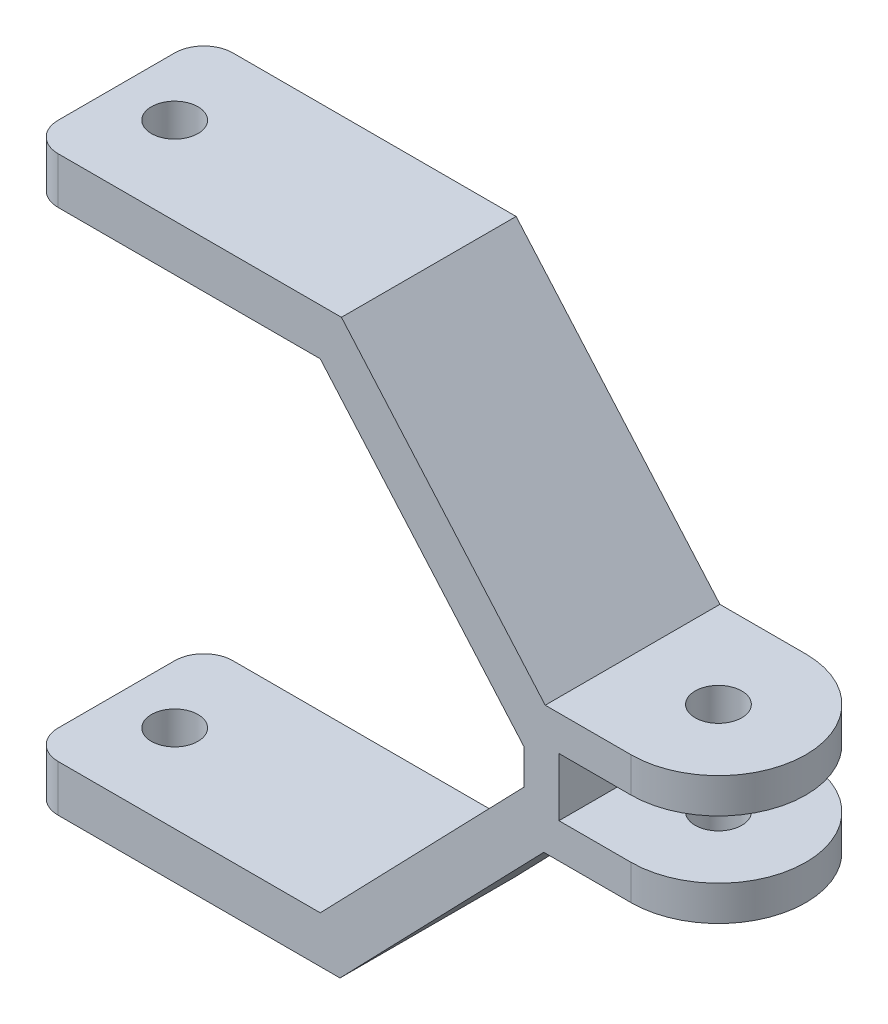
ISO-10303-21;
HEADER;
FILE_DESCRIPTION(('STEP AP214'),'2;1');
FILE_NAME('part.step','',(''),(''),'','','');
FILE_SCHEMA(('AUTOMOTIVE_DESIGN { 1 0 10303 214 1 1 1 1 }'));
ENDSEC;
DATA;
#1=APPLICATION_CONTEXT('core data for automotive mechanical design processes');
#2=APPLICATION_PROTOCOL_DEFINITION('international standard','automotive_design',2000,#1);
#3=PRODUCT_CONTEXT('',#1,'mechanical');
#4=PRODUCT('Part','Part','',(#3));
#5=PRODUCT_RELATED_PRODUCT_CATEGORY('part','',(#4));
#6=PRODUCT_DEFINITION_FORMATION('','',#4);
#7=PRODUCT_DEFINITION_CONTEXT('part definition',#1,'design');
#8=PRODUCT_DEFINITION('design','',#6,#7);
#9=PRODUCT_DEFINITION_SHAPE('','',#8);
#10=(LENGTH_UNIT() NAMED_UNIT(*) SI_UNIT(.MILLI.,.METRE.));
#11=(NAMED_UNIT(*) PLANE_ANGLE_UNIT() SI_UNIT($,.RADIAN.));
#12=(NAMED_UNIT(*) SI_UNIT($,.STERADIAN.) SOLID_ANGLE_UNIT());
#13=UNCERTAINTY_MEASURE_WITH_UNIT(LENGTH_MEASURE(1.E-05),#10,'distance_accuracy_value','');
#14=(GEOMETRIC_REPRESENTATION_CONTEXT(3) GLOBAL_UNCERTAINTY_ASSIGNED_CONTEXT((#13)) GLOBAL_UNIT_ASSIGNED_CONTEXT((#10,
#11,#12)) REPRESENTATION_CONTEXT('',''));
#15=CARTESIAN_POINT('',(0.,0.,0.));
#16=DIRECTION('',(0.,0.,1.));
#17=DIRECTION('',(1.,0.,0.));
#18=AXIS2_PLACEMENT_3D('',#15,#16,#17);
#19=CARTESIAN_POINT('',(-26.6964809757769,45.2,15.));
#20=DIRECTION('',(0.75420147757774,0.656643077493058,0.));
#21=DIRECTION('',(-0.656643077493058,0.75420147757774,0.));
#22=AXIS2_PLACEMENT_3D('',#19,#20,#21);
#23=PLANE('',#22);
#24=DIRECTION('',(0.656643077493058,-0.75420147757774,0.));
#25=VECTOR('',#24,1.);
#26=CARTESIAN_POINT('',(-26.6964809757769,45.2,0.));
#27=LINE('',#26,#25);
#28=CARTESIAN_POINT('',(-26.6964809757769,45.2,0.));
#29=VERTEX_POINT('',#28);
#30=CARTESIAN_POINT('',(-9.19648097577691,25.1,0.));
#31=VERTEX_POINT('',#30);
#32=EDGE_CURVE('E231',#29,#31,#27,.T.);
#33=ORIENTED_EDGE('',*,*,#32,.T.);
#34=DIRECTION('',(0.,0.,-1.));
#35=VECTOR('',#34,1.);
#36=CARTESIAN_POINT('',(-9.19648097577691,25.1,15.));
#37=LINE('',#36,#35);
#38=CARTESIAN_POINT('',(-9.19648097577691,25.1,15.));
#39=VERTEX_POINT('',#38);
#40=EDGE_CURVE('E332',#39,#31,#37,.T.);
#41=ORIENTED_EDGE('',*,*,#40,.F.);
#42=DIRECTION('',(0.656643077493058,-0.75420147757774,0.));
#43=VECTOR('',#42,1.);
#44=CARTESIAN_POINT('',(-26.6964809757769,45.2,15.));
#45=LINE('',#44,#43);
#46=CARTESIAN_POINT('',(-26.6964809757769,45.2,15.));
#47=VERTEX_POINT('',#46);
#48=EDGE_CURVE('E232',#47,#39,#45,.T.);
#49=ORIENTED_EDGE('',*,*,#48,.F.);
#50=DIRECTION('',(0.,0.,-1.));
#51=VECTOR('',#50,1.);
#52=CARTESIAN_POINT('',(-26.6964809757769,45.2,15.));
#53=LINE('',#52,#51);
#54=EDGE_CURVE('E267',#47,#29,#53,.T.);
#55=ORIENTED_EDGE('',*,*,#54,.T.);
#56=EDGE_LOOP('',(#33,#41,#49,#55));
#57=FACE_BOUND('',#56,.T.);
#58=ADVANCED_FACE('F33',(#57),#23,.F.);
#59=CARTESIAN_POINT('',(-9.19648097577691,25.1,15.));
#60=DIRECTION('',(1.,0.,0.));
#61=DIRECTION('',(0.,1.,0.));
#62=AXIS2_PLACEMENT_3D('',#59,#60,#61);
#63=PLANE('',#62);
#64=DIRECTION('',(0.,-1.,0.));
#65=VECTOR('',#64,1.);
#66=CARTESIAN_POINT('',(-9.19648097577691,25.1,0.));
#67=LINE('',#66,#65);
#68=CARTESIAN_POINT('',(-9.19648097577692,22.1,0.));
#69=VERTEX_POINT('',#68);
#70=EDGE_CURVE('E270',#31,#69,#67,.T.);
#71=ORIENTED_EDGE('',*,*,#70,.T.);
#72=DIRECTION('',(0.,0.,-1.));
#73=VECTOR('',#72,1.);
#74=CARTESIAN_POINT('',(-9.19648097577692,22.1,15.));
#75=LINE('',#74,#73);
#76=CARTESIAN_POINT('',(-9.19648097577692,22.1,15.));
#77=VERTEX_POINT('',#76);
#78=EDGE_CURVE('E329',#77,#69,#75,.T.);
#79=ORIENTED_EDGE('',*,*,#78,.F.);
#80=DIRECTION('',(0.,-1.,0.));
#81=VECTOR('',#80,1.);
#82=CARTESIAN_POINT('',(-9.19648097577691,25.1,15.));
#83=LINE('',#82,#81);
#84=EDGE_CURVE('E235',#39,#77,#83,.T.);
#85=ORIENTED_EDGE('',*,*,#84,.F.);
#86=ORIENTED_EDGE('',*,*,#40,.T.);
#87=EDGE_LOOP('',(#71,#79,#85,#86));
#88=FACE_BOUND('',#87,.T.);
#89=ADVANCED_FACE('F398',(#88),#63,.F.);
#90=CARTESIAN_POINT('',(-9.19648097577692,22.1,15.));
#91=DIRECTION('',(0.718922211716419,-0.695090536189907,0.));
#92=DIRECTION('',(0.695090536189907,0.718922211716419,0.));
#93=AXIS2_PLACEMENT_3D('',#90,#91,#92);
#94=PLANE('',#93);
#95=DIRECTION('',(-0.695090536189907,-0.718922211716419,0.));
#96=VECTOR('',#95,1.);
#97=CARTESIAN_POINT('',(-9.19648097577692,22.1,0.));
#98=LINE('',#97,#96);
#99=CARTESIAN_POINT('',(-26.6964809757769,4.,0.));
#100=VERTEX_POINT('',#99);
#101=EDGE_CURVE('E272',#69,#100,#98,.T.);
#102=ORIENTED_EDGE('',*,*,#101,.T.);
#103=DIRECTION('',(0.,0.,-1.));
#104=VECTOR('',#103,1.);
#105=CARTESIAN_POINT('',(-26.6964809757769,4.,15.));
#106=LINE('',#105,#104);
#107=CARTESIAN_POINT('',(-26.6964809757769,4.,15.));
#108=VERTEX_POINT('',#107);
#109=EDGE_CURVE('E326',#108,#100,#106,.T.);
#110=ORIENTED_EDGE('',*,*,#109,.F.);
#111=DIRECTION('',(-0.695090536189907,-0.718922211716419,0.));
#112=VECTOR('',#111,1.);
#113=CARTESIAN_POINT('',(-9.19648097577692,22.1,15.));
#114=LINE('',#113,#112);
#115=EDGE_CURVE('E238',#77,#108,#114,.T.);
#116=ORIENTED_EDGE('',*,*,#115,.F.);
#117=ORIENTED_EDGE('',*,*,#78,.T.);
#118=EDGE_LOOP('',(#102,#110,#116,#117));
#119=FACE_BOUND('',#118,.T.);
#120=ADVANCED_FACE('F386',(#119),#94,.F.);
#121=CARTESIAN_POINT('',(-51.6964809757769,3.99999999999999,15.));
#122=DIRECTION('',(0.,-1.,0.));
#123=DIRECTION('',(0.,0.,-1.));
#124=AXIS2_PLACEMENT_3D('',#121,#122,#123);
#125=PLANE('',#124);
#126=CARTESIAN_POINT('',(-46.6964809757769,3.99999999999999,7.5));
#127=DIRECTION('',(0.,-1.,0.));
#128=DIRECTION('',(0.,0.,-1.));
#129=AXIS2_PLACEMENT_3D('',#126,#127,#128);
#130=CIRCLE('',#129,2.);
#131=CARTESIAN_POINT('',(-44.6964809757769,4.,7.5));
#132=VERTEX_POINT('',#131);
#133=EDGE_CURVE('E228',#132,#132,#130,.T.);
#134=ORIENTED_EDGE('',*,*,#133,.T.);
#135=EDGE_LOOP('',(#134));
#136=FACE_BOUND('',#135,.T.);
#137=DIRECTION('',(0.,0.,-1.));
#138=VECTOR('',#137,1.);
#139=CARTESIAN_POINT('',(-51.6964809757769,3.99999999999999,15.));
#140=LINE('',#139,#138);
#141=CARTESIAN_POINT('',(-51.6964809757769,3.99999999999999,12.5));
#142=VERTEX_POINT('',#141);
#143=CARTESIAN_POINT('',(-51.6964809757769,3.99999999999999,2.5));
#144=VERTEX_POINT('',#143);
#145=EDGE_CURVE('E324',#142,#144,#140,.T.);
#146=ORIENTED_EDGE('',*,*,#145,.F.);
#147=CARTESIAN_POINT('',(-49.1964809757769,3.99999999999999,12.5));
#148=DIRECTION('',(0.,-1.,0.));
#149=DIRECTION('',(0.,0.,-1.));
#150=AXIS2_PLACEMENT_3D('',#147,#148,#149);
#151=CIRCLE('',#150,2.5);
#152=CARTESIAN_POINT('',(-49.1964809757769,3.99999999999999,15.));
#153=VERTEX_POINT('',#152);
#154=EDGE_CURVE('E11',#142,#153,#151,.F.);
#155=ORIENTED_EDGE('',*,*,#154,.T.);
#156=DIRECTION('',(-1.,0.,0.));
#157=VECTOR('',#156,1.);
#158=CARTESIAN_POINT('',(-26.6964809757769,4.,15.));
#159=LINE('',#158,#157);
#160=EDGE_CURVE('E240',#108,#153,#159,.T.);
#161=ORIENTED_EDGE('',*,*,#160,.F.);
#162=ORIENTED_EDGE('',*,*,#109,.T.);
#163=DIRECTION('',(-1.,0.,0.));
#164=VECTOR('',#163,1.);
#165=CARTESIAN_POINT('',(-51.6964809757769,3.99999999999999,0.));
#166=LINE('',#165,#164);
#167=CARTESIAN_POINT('',(-49.1964809757769,3.99999999999999,0.));
#168=VERTEX_POINT('',#167);
#169=EDGE_CURVE('E275',#100,#168,#166,.T.);
#170=ORIENTED_EDGE('',*,*,#169,.T.);
#171=CARTESIAN_POINT('',(-49.1964809757769,3.99999999999999,2.5));
#172=DIRECTION('',(0.,-1.,0.));
#173=DIRECTION('',(0.,0.,-1.));
#174=AXIS2_PLACEMENT_3D('',#171,#172,#173);
#175=CIRCLE('',#174,2.5);
#176=EDGE_CURVE('E41',#168,#144,#175,.F.);
#177=ORIENTED_EDGE('',*,*,#176,.T.);
#178=EDGE_LOOP('',(#146,#155,#161,#162,#170,#177));
#179=FACE_BOUND('',#178,.T.);
#180=ADVANCED_FACE('F384',(#136,#179),#125,.F.);
#181=CARTESIAN_POINT('',(-51.6964809757769,0.,15.));
#182=DIRECTION('',(1.,0.,0.));
#183=DIRECTION('',(0.,0.,-1.));
#184=AXIS2_PLACEMENT_3D('',#181,#182,#183);
#185=PLANE('',#184);
#186=DIRECTION('',(0.,0.,-1.));
#187=VECTOR('',#186,1.);
#188=CARTESIAN_POINT('',(-51.6964809757769,0.,15.));
#189=LINE('',#188,#187);
#190=CARTESIAN_POINT('',(-51.6964809757769,0.,12.5));
#191=VERTEX_POINT('',#190);
#192=CARTESIAN_POINT('',(-51.6964809757769,0.,2.5));
#193=VERTEX_POINT('',#192);
#194=EDGE_CURVE('E321',#191,#193,#189,.T.);
#195=ORIENTED_EDGE('',*,*,#194,.F.);
#196=DIRECTION('',(0.,-1.,0.));
#197=VECTOR('',#196,1.);
#198=CARTESIAN_POINT('',(-51.6964809757769,0.,12.5));
#199=LINE('',#198,#197);
#200=EDGE_CURVE('E54',#191,#142,#199,.F.);
#201=ORIENTED_EDGE('',*,*,#200,.T.);
#202=ORIENTED_EDGE('',*,*,#145,.T.);
#203=DIRECTION('',(0.,-1.,0.));
#204=VECTOR('',#203,1.);
#205=CARTESIAN_POINT('',(-51.6964809757769,0.,2.5));
#206=LINE('',#205,#204);
#207=EDGE_CURVE('E364',#144,#193,#206,.T.);
#208=ORIENTED_EDGE('',*,*,#207,.T.);
#209=EDGE_LOOP('',(#195,#201,#202,#208));
#210=FACE_BOUND('',#209,.T.);
#211=ADVANCED_FACE('F368',(#210),#185,.F.);
#212=CARTESIAN_POINT('',(-25.,0.,15.));
#213=DIRECTION('',(0.,1.,0.));
#214=DIRECTION('',(-1.,0.,0.));
#215=AXIS2_PLACEMENT_3D('',#212,#213,#214);
#216=PLANE('',#215);
#217=CARTESIAN_POINT('',(-46.6964809757769,0.,7.5));
#218=DIRECTION('',(0.,-1.,0.));
#219=DIRECTION('',(1.,0.,0.));
#220=AXIS2_PLACEMENT_3D('',#217,#218,#219);
#221=CIRCLE('',#220,2.);
#222=CARTESIAN_POINT('',(-44.6964809757769,0.,7.5));
#223=VERTEX_POINT('',#222);
#224=EDGE_CURVE('E219',#223,#223,#221,.T.);
#225=ORIENTED_EDGE('',*,*,#224,.F.);
#226=EDGE_LOOP('',(#225));
#227=FACE_BOUND('',#226,.T.);
#228=DIRECTION('',(1.,0.,0.));
#229=VECTOR('',#228,1.);
#230=CARTESIAN_POINT('',(-25.,0.,15.));
#231=LINE('',#230,#229);
#232=CARTESIAN_POINT('',(-49.1964809757769,0.,15.));
#233=VERTEX_POINT('',#232);
#234=CARTESIAN_POINT('',(-25.,0.,15.));
#235=VERTEX_POINT('',#234);
#236=EDGE_CURVE('E243',#233,#235,#231,.T.);
#237=ORIENTED_EDGE('',*,*,#236,.F.);
#238=CARTESIAN_POINT('',(-49.1964809757769,0.,12.5));
#239=DIRECTION('',(0.,1.,0.));
#240=DIRECTION('',(-1.,0.,0.));
#241=AXIS2_PLACEMENT_3D('',#238,#239,#240);
#242=CIRCLE('',#241,2.5);
#243=EDGE_CURVE('E362',#233,#191,#242,.F.);
#244=ORIENTED_EDGE('',*,*,#243,.T.);
#245=ORIENTED_EDGE('',*,*,#194,.T.);
#246=CARTESIAN_POINT('',(-49.1964809757769,0.,2.5));
#247=DIRECTION('',(0.,1.,0.));
#248=DIRECTION('',(-1.,0.,0.));
#249=AXIS2_PLACEMENT_3D('',#246,#247,#248);
#250=CIRCLE('',#249,2.5);
#251=CARTESIAN_POINT('',(-49.1964809757769,0.,0.));
#252=VERTEX_POINT('',#251);
#253=EDGE_CURVE('E360',#193,#252,#250,.F.);
#254=ORIENTED_EDGE('',*,*,#253,.T.);
#255=DIRECTION('',(1.,0.,0.));
#256=VECTOR('',#255,1.);
#257=CARTESIAN_POINT('',(-25.,0.,0.));
#258=LINE('',#257,#256);
#259=CARTESIAN_POINT('',(-25.,0.,0.));
#260=VERTEX_POINT('',#259);
#261=EDGE_CURVE('E277',#252,#260,#258,.T.);
#262=ORIENTED_EDGE('',*,*,#261,.T.);
#263=DIRECTION('',(0.,0.,-1.));
#264=VECTOR('',#263,1.);
#265=CARTESIAN_POINT('',(-25.,0.,15.));
#266=LINE('',#265,#264);
#267=EDGE_CURVE('E318',#235,#260,#266,.T.);
#268=ORIENTED_EDGE('',*,*,#267,.F.);
#269=EDGE_LOOP('',(#237,#244,#245,#254,#262,#268));
#270=FACE_BOUND('',#269,.T.);
#271=ADVANCED_FACE('F372',(#227,#270),#216,.F.);
#272=CARTESIAN_POINT('',(-7.5,18.1,15.));
#273=DIRECTION('',(-0.718922211716419,0.695090536189907,0.));
#274=DIRECTION('',(-0.695090536189907,-0.718922211716419,0.));
#275=AXIS2_PLACEMENT_3D('',#272,#273,#274);
#276=PLANE('',#275);
#277=DIRECTION('',(0.695090536189907,0.718922211716419,0.));
#278=VECTOR('',#277,1.);
#279=CARTESIAN_POINT('',(-7.5,18.1,0.));
#280=LINE('',#279,#278);
#281=CARTESIAN_POINT('',(-7.5,18.1,0.));
#282=VERTEX_POINT('',#281);
#283=EDGE_CURVE('E279',#260,#282,#280,.T.);
#284=ORIENTED_EDGE('',*,*,#283,.T.);
#285=DIRECTION('',(0.,0.,-1.));
#286=VECTOR('',#285,1.);
#287=CARTESIAN_POINT('',(-7.5,18.1,15.));
#288=LINE('',#287,#286);
#289=CARTESIAN_POINT('',(-7.5,18.1,15.));
#290=VERTEX_POINT('',#289);
#291=EDGE_CURVE('E316',#290,#282,#288,.T.);
#292=ORIENTED_EDGE('',*,*,#291,.F.);
#293=DIRECTION('',(0.695090536189907,0.718922211716419,0.));
#294=VECTOR('',#293,1.);
#295=CARTESIAN_POINT('',(-7.5,18.1,15.));
#296=LINE('',#295,#294);
#297=EDGE_CURVE('E245',#235,#290,#296,.T.);
#298=ORIENTED_EDGE('',*,*,#297,.F.);
#299=ORIENTED_EDGE('',*,*,#267,.T.);
#300=EDGE_LOOP('',(#284,#292,#298,#299));
#301=FACE_BOUND('',#300,.T.);
#302=ADVANCED_FACE('F474',(#301),#276,.F.);
#303=CARTESIAN_POINT('',(-7.5,18.1,15.));
#304=DIRECTION('',(0.,1.,0.));
#305=DIRECTION('',(0.,0.,1.));
#306=AXIS2_PLACEMENT_3D('',#303,#304,#305);
#307=PLANE('',#306);
#308=CARTESIAN_POINT('',(0.,18.1,7.5));
#309=DIRECTION('',(0.,1.,0.));
#310=DIRECTION('',(0.,0.,1.));
#311=AXIS2_PLACEMENT_3D('',#308,#309,#310);
#312=CIRCLE('',#311,2.);
#313=CARTESIAN_POINT('',(0.,18.1,9.5));
#314=VERTEX_POINT('',#313);
#315=EDGE_CURVE('E714',#314,#314,#312,.T.);
#316=ORIENTED_EDGE('',*,*,#315,.T.);
#317=EDGE_LOOP('',(#316));
#318=FACE_BOUND('',#317,.T.);
#319=ORIENTED_EDGE('',*,*,#291,.T.);
#320=DIRECTION('',(1.,0.,0.));
#321=VECTOR('',#320,1.);
#322=CARTESIAN_POINT('',(-7.5,18.1,0.));
#323=LINE('',#322,#321);
#324=CARTESIAN_POINT('',(0.,18.1,0.));
#325=VERTEX_POINT('',#324);
#326=EDGE_CURVE('E282',#282,#325,#323,.T.);
#327=ORIENTED_EDGE('',*,*,#326,.T.);
#328=CARTESIAN_POINT('',(0.,18.1,7.5));
#329=DIRECTION('',(0.,-1.,0.));
#330=DIRECTION('',(0.,0.,-1.));
#331=AXIS2_PLACEMENT_3D('',#328,#329,#330);
#332=CIRCLE('',#331,7.5);
#333=CARTESIAN_POINT('',(0.,18.1,15.));
#334=VERTEX_POINT('',#333);
#335=EDGE_CURVE('E210',#325,#334,#332,.T.);
#336=ORIENTED_EDGE('',*,*,#335,.T.);
#337=DIRECTION('',(1.,0.,0.));
#338=VECTOR('',#337,1.);
#339=CARTESIAN_POINT('',(-7.5,18.1,15.));
#340=LINE('',#339,#338);
#341=EDGE_CURVE('E247',#290,#334,#340,.T.);
#342=ORIENTED_EDGE('',*,*,#341,.F.);
#343=EDGE_LOOP('',(#319,#327,#336,#342));
#344=FACE_BOUND('',#343,.T.);
#345=ADVANCED_FACE('F470',(#318,#344),#307,.F.);
#346=CARTESIAN_POINT('',(0.,21.1,15.));
#347=DIRECTION('',(0.,-1.,0.));
#348=DIRECTION('',(0.,0.,-1.));
#349=AXIS2_PLACEMENT_3D('',#346,#347,#348);
#350=PLANE('',#349);
#351=CARTESIAN_POINT('',(0.,21.1,7.5));
#352=DIRECTION('',(0.,-1.,0.));
#353=DIRECTION('',(0.,0.,-1.));
#354=AXIS2_PLACEMENT_3D('',#351,#352,#353);
#355=CIRCLE('',#354,2.);
#356=CARTESIAN_POINT('',(0.,21.1,5.5));
#357=VERTEX_POINT('',#356);
#358=EDGE_CURVE('E208',#357,#357,#355,.T.);
#359=ORIENTED_EDGE('',*,*,#358,.T.);
#360=EDGE_LOOP('',(#359));
#361=FACE_BOUND('',#360,.T.);
#362=DIRECTION('',(-1.,0.,0.));
#363=VECTOR('',#362,1.);
#364=CARTESIAN_POINT('',(0.,21.1,0.));
#365=LINE('',#364,#363);
#366=CARTESIAN_POINT('',(0.,21.1,0.));
#367=VERTEX_POINT('',#366);
#368=CARTESIAN_POINT('',(-6.19648097577692,21.1,0.));
#369=VERTEX_POINT('',#368);
#370=EDGE_CURVE('E287',#367,#369,#365,.T.);
#371=ORIENTED_EDGE('',*,*,#370,.T.);
#372=DIRECTION('',(0.,0.,-1.));
#373=VECTOR('',#372,1.);
#374=CARTESIAN_POINT('',(-6.19648097577692,21.1,15.));
#375=LINE('',#374,#373);
#376=CARTESIAN_POINT('',(-6.19648097577692,21.1,15.));
#377=VERTEX_POINT('',#376);
#378=EDGE_CURVE('E314',#377,#369,#375,.T.);
#379=ORIENTED_EDGE('',*,*,#378,.F.);
#380=DIRECTION('',(-1.,0.,0.));
#381=VECTOR('',#380,1.);
#382=CARTESIAN_POINT('',(0.,21.1,15.));
#383=LINE('',#382,#381);
#384=CARTESIAN_POINT('',(0.,21.1,15.));
#385=VERTEX_POINT('',#384);
#386=EDGE_CURVE('E251',#385,#377,#383,.T.);
#387=ORIENTED_EDGE('',*,*,#386,.F.);
#388=CARTESIAN_POINT('',(0.,21.1,7.5));
#389=DIRECTION('',(0.,-1.,0.));
#390=DIRECTION('',(0.,0.,-1.));
#391=AXIS2_PLACEMENT_3D('',#388,#389,#390);
#392=CIRCLE('',#391,7.5);
#393=EDGE_CURVE('E216',#367,#385,#392,.T.);
#394=ORIENTED_EDGE('',*,*,#393,.F.);
#395=EDGE_LOOP('',(#371,#379,#387,#394));
#396=FACE_BOUND('',#395,.T.);
#397=ADVANCED_FACE('F466',(#361,#396),#350,.F.);
#398=CARTESIAN_POINT('',(-6.19648097577692,26.1,15.));
#399=DIRECTION('',(-1.,0.,0.));
#400=DIRECTION('',(0.,-1.,0.));
#401=AXIS2_PLACEMENT_3D('',#398,#399,#400);
#402=PLANE('',#401);
#403=DIRECTION('',(0.,1.,0.));
#404=VECTOR('',#403,1.);
#405=CARTESIAN_POINT('',(-6.19648097577692,26.1,0.));
#406=LINE('',#405,#404);
#407=CARTESIAN_POINT('',(-6.19648097577692,26.1,0.));
#408=VERTEX_POINT('',#407);
#409=EDGE_CURVE('E290',#369,#408,#406,.T.);
#410=ORIENTED_EDGE('',*,*,#409,.T.);
#411=DIRECTION('',(0.,0.,-1.));
#412=VECTOR('',#411,1.);
#413=CARTESIAN_POINT('',(-6.19648097577692,26.1,15.));
#414=LINE('',#413,#412);
#415=CARTESIAN_POINT('',(-6.19648097577692,26.1,15.));
#416=VERTEX_POINT('',#415);
#417=EDGE_CURVE('E312',#416,#408,#414,.T.);
#418=ORIENTED_EDGE('',*,*,#417,.F.);
#419=DIRECTION('',(0.,1.,0.));
#420=VECTOR('',#419,1.);
#421=CARTESIAN_POINT('',(-6.19648097577692,26.1,15.));
#422=LINE('',#421,#420);
#423=EDGE_CURVE('E253',#377,#416,#422,.T.);
#424=ORIENTED_EDGE('',*,*,#423,.F.);
#425=ORIENTED_EDGE('',*,*,#378,.T.);
#426=EDGE_LOOP('',(#410,#418,#424,#425));
#427=FACE_BOUND('',#426,.T.);
#428=ADVANCED_FACE('F462',(#427),#402,.F.);
#429=CARTESIAN_POINT('',(0.,26.1,15.));
#430=DIRECTION('',(0.,1.,0.));
#431=DIRECTION('',(-1.,0.,0.));
#432=AXIS2_PLACEMENT_3D('',#429,#430,#431);
#433=PLANE('',#432);
#434=CARTESIAN_POINT('',(0.,26.1,7.5));
#435=DIRECTION('',(0.,1.,0.));
#436=DIRECTION('',(-1.,0.,0.));
#437=AXIS2_PLACEMENT_3D('',#434,#435,#436);
#438=CIRCLE('',#437,2.);
#439=CARTESIAN_POINT('',(-2.,26.1,7.5));
#440=VERTEX_POINT('',#439);
#441=EDGE_CURVE('E213',#440,#440,#438,.T.);
#442=ORIENTED_EDGE('',*,*,#441,.T.);
#443=EDGE_LOOP('',(#442));
#444=FACE_BOUND('',#443,.T.);
#445=DIRECTION('',(1.,0.,0.));
#446=VECTOR('',#445,1.);
#447=CARTESIAN_POINT('',(0.,26.1,0.));
#448=LINE('',#447,#446);
#449=CARTESIAN_POINT('',(0.,26.1,0.));
#450=VERTEX_POINT('',#449);
#451=EDGE_CURVE('E203',#408,#450,#448,.T.);
#452=ORIENTED_EDGE('',*,*,#451,.T.);
#453=CARTESIAN_POINT('',(0.,26.1,7.5));
#454=DIRECTION('',(0.,1.,0.));
#455=DIRECTION('',(0.,0.,1.));
#456=AXIS2_PLACEMENT_3D('',#453,#454,#455);
#457=CIRCLE('',#456,7.5);
#458=CARTESIAN_POINT('',(0.,26.1,15.));
#459=VERTEX_POINT('',#458);
#460=EDGE_CURVE('E202',#459,#450,#457,.T.);
#461=ORIENTED_EDGE('',*,*,#460,.F.);
#462=DIRECTION('',(1.,0.,0.));
#463=VECTOR('',#462,1.);
#464=CARTESIAN_POINT('',(0.,26.1,15.));
#465=LINE('',#464,#463);
#466=EDGE_CURVE('E255',#416,#459,#465,.T.);
#467=ORIENTED_EDGE('',*,*,#466,.F.);
#468=ORIENTED_EDGE('',*,*,#417,.T.);
#469=EDGE_LOOP('',(#452,#461,#467,#468));
#470=FACE_BOUND('',#469,.T.);
#471=ADVANCED_FACE('F458',(#444,#470),#433,.F.);
#472=CARTESIAN_POINT('',(-7.3754454423558,29.1,15.));
#473=DIRECTION('',(0.,-1.,0.));
#474=DIRECTION('',(0.,0.,-1.));
#475=AXIS2_PLACEMENT_3D('',#472,#473,#474);
#476=PLANE('',#475);
#477=CARTESIAN_POINT('',(0.,29.1,7.5));
#478=DIRECTION('',(0.,1.,0.));
#479=DIRECTION('',(0.,0.,1.));
#480=AXIS2_PLACEMENT_3D('',#477,#478,#479);
#481=CIRCLE('',#480,2.);
#482=CARTESIAN_POINT('',(0.,29.1,9.5));
#483=VERTEX_POINT('',#482);
#484=EDGE_CURVE('E711',#483,#483,#481,.T.);
#485=ORIENTED_EDGE('',*,*,#484,.F.);
#486=EDGE_LOOP('',(#485));
#487=FACE_BOUND('',#486,.T.);
#488=DIRECTION('',(-1.,0.,0.));
#489=VECTOR('',#488,1.);
#490=CARTESIAN_POINT('',(-7.3754454423558,29.1,0.));
#491=LINE('',#490,#489);
#492=CARTESIAN_POINT('',(0.,29.1,0.));
#493=VERTEX_POINT('',#492);
#494=CARTESIAN_POINT('',(-7.3754454423558,29.1,0.));
#495=VERTEX_POINT('',#494);
#496=EDGE_CURVE('E183',#493,#495,#491,.T.);
#497=ORIENTED_EDGE('',*,*,#496,.T.);
#498=DIRECTION('',(0.,0.,-1.));
#499=VECTOR('',#498,1.);
#500=CARTESIAN_POINT('',(-7.3754454423558,29.1,15.));
#501=LINE('',#500,#499);
#502=CARTESIAN_POINT('',(-7.3754454423558,29.1,15.));
#503=VERTEX_POINT('',#502);
#504=EDGE_CURVE('E310',#503,#495,#501,.T.);
#505=ORIENTED_EDGE('',*,*,#504,.F.);
#506=DIRECTION('',(-1.,0.,0.));
#507=VECTOR('',#506,1.);
#508=CARTESIAN_POINT('',(-7.3754454423558,29.1,15.));
#509=LINE('',#508,#507);
#510=CARTESIAN_POINT('',(0.,29.1,15.));
#511=VERTEX_POINT('',#510);
#512=EDGE_CURVE('E207',#511,#503,#509,.T.);
#513=ORIENTED_EDGE('',*,*,#512,.F.);
#514=CARTESIAN_POINT('',(0.,29.1,7.5));
#515=DIRECTION('',(0.,1.,0.));
#516=DIRECTION('',(0.,0.,1.));
#517=AXIS2_PLACEMENT_3D('',#514,#515,#516);
#518=CIRCLE('',#517,7.5);
#519=EDGE_CURVE('E200',#511,#493,#518,.T.);
#520=ORIENTED_EDGE('',*,*,#519,.T.);
#521=EDGE_LOOP('',(#497,#505,#513,#520));
#522=FACE_BOUND('',#521,.T.);
#523=ADVANCED_FACE('F206',(#487,#522),#476,.F.);
#524=CARTESIAN_POINT('',(-24.8754454423558,49.2,15.));
#525=DIRECTION('',(-0.75420147757774,-0.656643077493058,0.));
#526=DIRECTION('',(0.656643077493058,-0.75420147757774,0.));
#527=AXIS2_PLACEMENT_3D('',#524,#525,#526);
#528=PLANE('',#527);
#529=DIRECTION('',(-0.656643077493058,0.75420147757774,0.));
#530=VECTOR('',#529,1.);
#531=CARTESIAN_POINT('',(-24.8754454423558,49.2,0.));
#532=LINE('',#531,#530);
#533=CARTESIAN_POINT('',(-24.8754454423558,49.2,0.));
#534=VERTEX_POINT('',#533);
#535=EDGE_CURVE('E191',#495,#534,#532,.T.);
#536=ORIENTED_EDGE('',*,*,#535,.T.);
#537=DIRECTION('',(0.,0.,-1.));
#538=VECTOR('',#537,1.);
#539=CARTESIAN_POINT('',(-24.8754454423558,49.2,15.));
#540=LINE('',#539,#538);
#541=CARTESIAN_POINT('',(-24.8754454423558,49.2,15.));
#542=VERTEX_POINT('',#541);
#543=EDGE_CURVE('E307',#542,#534,#540,.T.);
#544=ORIENTED_EDGE('',*,*,#543,.F.);
#545=DIRECTION('',(-0.656643077493058,0.75420147757774,0.));
#546=VECTOR('',#545,1.);
#547=CARTESIAN_POINT('',(-24.8754454423558,49.2,15.));
#548=LINE('',#547,#546);
#549=EDGE_CURVE('E260',#503,#542,#548,.T.);
#550=ORIENTED_EDGE('',*,*,#549,.F.);
#551=ORIENTED_EDGE('',*,*,#504,.T.);
#552=EDGE_LOOP('',(#536,#544,#550,#551));
#553=FACE_BOUND('',#552,.T.);
#554=ADVANCED_FACE('F434',(#553),#528,.F.);
#555=CARTESIAN_POINT('',(-24.8754454423558,49.2,15.));
#556=DIRECTION('',(0.,-1.,0.));
#557=DIRECTION('',(0.,0.,-1.));
#558=AXIS2_PLACEMENT_3D('',#555,#556,#557);
#559=PLANE('',#558);
#560=CARTESIAN_POINT('',(-46.6964809757769,49.2,7.5));
#561=DIRECTION('',(0.,-1.,0.));
#562=DIRECTION('',(0.,0.,-1.));
#563=AXIS2_PLACEMENT_3D('',#560,#561,#562);
#564=CIRCLE('',#563,2.);
#565=CARTESIAN_POINT('',(-44.6964809757769,49.2,7.5));
#566=VERTEX_POINT('',#565);
#567=EDGE_CURVE('E224',#566,#566,#564,.F.);
#568=ORIENTED_EDGE('',*,*,#567,.F.);
#569=EDGE_LOOP('',(#568));
#570=FACE_BOUND('',#569,.T.);
#571=DIRECTION('',(0.,0.,-1.));
#572=VECTOR('',#571,1.);
#573=CARTESIAN_POINT('',(-51.6964809757769,49.2,15.));
#574=LINE('',#573,#572);
#575=CARTESIAN_POINT('',(-51.6964809757769,49.2,12.5));
#576=VERTEX_POINT('',#575);
#577=CARTESIAN_POINT('',(-51.6964809757769,49.2,2.5));
#578=VERTEX_POINT('',#577);
#579=EDGE_CURVE('E304',#576,#578,#574,.T.);
#580=ORIENTED_EDGE('',*,*,#579,.F.);
#581=CARTESIAN_POINT('',(-49.1964809757769,49.2,12.5));
#582=DIRECTION('',(0.,-1.,0.));
#583=DIRECTION('',(0.,0.,-1.));
#584=AXIS2_PLACEMENT_3D('',#581,#582,#583);
#585=CIRCLE('',#584,2.5);
#586=CARTESIAN_POINT('',(-49.1964809757769,49.2,15.));
#587=VERTEX_POINT('',#586);
#588=EDGE_CURVE('E354',#576,#587,#585,.F.);
#589=ORIENTED_EDGE('',*,*,#588,.T.);
#590=DIRECTION('',(-1.,0.,0.));
#591=VECTOR('',#590,1.);
#592=CARTESIAN_POINT('',(-24.8754454423558,49.2,15.));
#593=LINE('',#592,#591);
#594=EDGE_CURVE('E262',#542,#587,#593,.T.);
#595=ORIENTED_EDGE('',*,*,#594,.F.);
#596=ORIENTED_EDGE('',*,*,#543,.T.);
#597=DIRECTION('',(-1.,0.,0.));
#598=VECTOR('',#597,1.);
#599=CARTESIAN_POINT('',(-24.8754454423558,49.2,0.));
#600=LINE('',#599,#598);
#601=CARTESIAN_POINT('',(-49.1964809757769,49.2,0.));
#602=VERTEX_POINT('',#601);
#603=EDGE_CURVE('E295',#534,#602,#600,.T.);
#604=ORIENTED_EDGE('',*,*,#603,.T.);
#605=CARTESIAN_POINT('',(-49.1964809757769,49.2,2.5));
#606=DIRECTION('',(0.,-1.,0.));
#607=DIRECTION('',(0.,0.,-1.));
#608=AXIS2_PLACEMENT_3D('',#605,#606,#607);
#609=CIRCLE('',#608,2.5);
#610=EDGE_CURVE('E352',#602,#578,#609,.F.);
#611=ORIENTED_EDGE('',*,*,#610,.T.);
#612=EDGE_LOOP('',(#580,#589,#595,#596,#604,#611));
#613=FACE_BOUND('',#612,.T.);
#614=ADVANCED_FACE('F422',(#570,#613),#559,.F.);
#615=CARTESIAN_POINT('',(-51.6964809757769,45.2,15.));
#616=DIRECTION('',(1.,0.,0.));
#617=DIRECTION('',(0.,0.,-1.));
#618=AXIS2_PLACEMENT_3D('',#615,#616,#617);
#619=PLANE('',#618);
#620=DIRECTION('',(0.,0.,-1.));
#621=VECTOR('',#620,1.);
#622=CARTESIAN_POINT('',(-51.6964809757769,45.2,15.));
#623=LINE('',#622,#621);
#624=CARTESIAN_POINT('',(-51.6964809757769,45.2,12.5));
#625=VERTEX_POINT('',#624);
#626=CARTESIAN_POINT('',(-51.6964809757769,45.2,2.5));
#627=VERTEX_POINT('',#626);
#628=EDGE_CURVE('E301',#625,#627,#623,.T.);
#629=ORIENTED_EDGE('',*,*,#628,.F.);
#630=DIRECTION('',(0.,-1.,0.));
#631=VECTOR('',#630,1.);
#632=CARTESIAN_POINT('',(-51.6964809757769,45.2,12.5));
#633=LINE('',#632,#631);
#634=EDGE_CURVE('E350',#625,#576,#633,.F.);
#635=ORIENTED_EDGE('',*,*,#634,.T.);
#636=ORIENTED_EDGE('',*,*,#579,.T.);
#637=DIRECTION('',(0.,-1.,0.));
#638=VECTOR('',#637,1.);
#639=CARTESIAN_POINT('',(-51.6964809757769,45.2,2.5));
#640=LINE('',#639,#638);
#641=EDGE_CURVE('E347',#578,#627,#640,.T.);
#642=ORIENTED_EDGE('',*,*,#641,.T.);
#643=EDGE_LOOP('',(#629,#635,#636,#642));
#644=FACE_BOUND('',#643,.T.);
#645=ADVANCED_FACE('F426',(#644),#619,.F.);
#646=CARTESIAN_POINT('',(-26.6964809757769,45.2,15.));
#647=DIRECTION('',(0.,1.,0.));
#648=DIRECTION('',(0.,0.,1.));
#649=AXIS2_PLACEMENT_3D('',#646,#647,#648);
#650=PLANE('',#649);
#651=CARTESIAN_POINT('',(-46.6964809757769,45.2,7.5));
#652=DIRECTION('',(0.,1.,0.));
#653=DIRECTION('',(0.,0.,1.));
#654=AXIS2_PLACEMENT_3D('',#651,#652,#653);
#655=CIRCLE('',#654,2.);
#656=CARTESIAN_POINT('',(-44.6964809757769,45.2,7.5));
#657=VERTEX_POINT('',#656);
#658=EDGE_CURVE('E227',#657,#657,#655,.T.);
#659=ORIENTED_EDGE('',*,*,#658,.T.);
#660=EDGE_LOOP('',(#659));
#661=FACE_BOUND('',#660,.T.);
#662=DIRECTION('',(1.,0.,0.));
#663=VECTOR('',#662,1.);
#664=CARTESIAN_POINT('',(-47.6964809757769,45.2,15.));
#665=LINE('',#664,#663);
#666=CARTESIAN_POINT('',(-49.1964809757769,45.2,15.));
#667=VERTEX_POINT('',#666);
#668=EDGE_CURVE('E265',#667,#47,#665,.T.);
#669=ORIENTED_EDGE('',*,*,#668,.F.);
#670=CARTESIAN_POINT('',(-49.1964809757769,45.2,12.5));
#671=DIRECTION('',(0.,1.,0.));
#672=DIRECTION('',(0.,0.,1.));
#673=AXIS2_PLACEMENT_3D('',#670,#671,#672);
#674=CIRCLE('',#673,2.5);
#675=EDGE_CURVE('E345',#667,#625,#674,.F.);
#676=ORIENTED_EDGE('',*,*,#675,.T.);
#677=ORIENTED_EDGE('',*,*,#628,.T.);
#678=CARTESIAN_POINT('',(-49.1964809757769,45.2,2.5));
#679=DIRECTION('',(0.,1.,0.));
#680=DIRECTION('',(0.,0.,1.));
#681=AXIS2_PLACEMENT_3D('',#678,#679,#680);
#682=CIRCLE('',#681,2.5);
#683=CARTESIAN_POINT('',(-49.1964809757769,45.2,0.));
#684=VERTEX_POINT('',#683);
#685=EDGE_CURVE('E343',#627,#684,#682,.F.);
#686=ORIENTED_EDGE('',*,*,#685,.T.);
#687=DIRECTION('',(1.,0.,0.));
#688=VECTOR('',#687,1.);
#689=CARTESIAN_POINT('',(-26.6964809757769,45.2,0.));
#690=LINE('',#689,#688);
#691=EDGE_CURVE('E236',#684,#29,#690,.T.);
#692=ORIENTED_EDGE('',*,*,#691,.T.);
#693=ORIENTED_EDGE('',*,*,#54,.F.);
#694=EDGE_LOOP('',(#669,#676,#677,#686,#692,#693));
#695=FACE_BOUND('',#694,.T.);
#696=ADVANCED_FACE('F437',(#661,#695),#650,.F.);
#697=CARTESIAN_POINT('',(0.,0.,15.));
#698=DIRECTION('',(0.,0.,-1.));
#699=DIRECTION('',(-1.,0.,0.));
#700=AXIS2_PLACEMENT_3D('',#697,#698,#699);
#701=PLANE('',#700);
#702=ORIENTED_EDGE('',*,*,#594,.T.);
#703=DIRECTION('',(0.,-1.,0.));
#704=VECTOR('',#703,1.);
#705=CARTESIAN_POINT('',(-49.1964809757769,0.,15.));
#706=LINE('',#705,#704);
#707=EDGE_CURVE('E340',#587,#667,#706,.T.);
#708=ORIENTED_EDGE('',*,*,#707,.T.);
#709=ORIENTED_EDGE('',*,*,#668,.T.);
#710=ORIENTED_EDGE('',*,*,#48,.T.);
#711=ORIENTED_EDGE('',*,*,#84,.T.);
#712=ORIENTED_EDGE('',*,*,#115,.T.);
#713=ORIENTED_EDGE('',*,*,#160,.T.);
#714=DIRECTION('',(0.,-1.,0.));
#715=VECTOR('',#714,1.);
#716=CARTESIAN_POINT('',(-49.1964809757769,0.,15.));
#717=LINE('',#716,#715);
#718=EDGE_CURVE('E335',#153,#233,#717,.T.);
#719=ORIENTED_EDGE('',*,*,#718,.T.);
#720=ORIENTED_EDGE('',*,*,#236,.T.);
#721=ORIENTED_EDGE('',*,*,#297,.T.);
#722=ORIENTED_EDGE('',*,*,#341,.T.);
#723=DIRECTION('',(0.,1.,0.));
#724=VECTOR('',#723,1.);
#725=CARTESIAN_POINT('',(0.,18.1,15.));
#726=LINE('',#725,#724);
#727=EDGE_CURVE('E249',#334,#385,#726,.T.);
#728=ORIENTED_EDGE('',*,*,#727,.T.);
#729=ORIENTED_EDGE('',*,*,#386,.T.);
#730=ORIENTED_EDGE('',*,*,#423,.T.);
#731=ORIENTED_EDGE('',*,*,#466,.T.);
#732=DIRECTION('',(0.,1.,0.));
#733=VECTOR('',#732,1.);
#734=CARTESIAN_POINT('',(0.,26.1,15.));
#735=LINE('',#734,#733);
#736=EDGE_CURVE('E257',#459,#511,#735,.T.);
#737=ORIENTED_EDGE('',*,*,#736,.T.);
#738=ORIENTED_EDGE('',*,*,#512,.T.);
#739=ORIENTED_EDGE('',*,*,#549,.T.);
#740=EDGE_LOOP('',(#702,#708,#709,#710,#711,#712,#713,#719,#720,#721,#722,#728,#729,#730,#731,
#737,#738,#739));
#741=FACE_BOUND('',#740,.T.);
#742=ADVANCED_FACE('F380',(#741),#701,.F.);
#743=CARTESIAN_POINT('',(0.,0.,0.));
#744=DIRECTION('',(0.,0.,-1.));
#745=DIRECTION('',(-1.,0.,0.));
#746=AXIS2_PLACEMENT_3D('',#743,#744,#745);
#747=PLANE('',#746);
#748=ORIENTED_EDGE('',*,*,#691,.F.);
#749=DIRECTION('',(0.,-1.,0.));
#750=VECTOR('',#749,1.);
#751=CARTESIAN_POINT('',(-49.1964809757769,49.2,0.));
#752=LINE('',#751,#750);
#753=EDGE_CURVE('E358',#684,#602,#752,.F.);
#754=ORIENTED_EDGE('',*,*,#753,.T.);
#755=ORIENTED_EDGE('',*,*,#603,.F.);
#756=ORIENTED_EDGE('',*,*,#535,.F.);
#757=ORIENTED_EDGE('',*,*,#496,.F.);
#758=DIRECTION('',(0.,1.,0.));
#759=VECTOR('',#758,1.);
#760=CARTESIAN_POINT('',(0.,26.1,0.));
#761=LINE('',#760,#759);
#762=EDGE_CURVE('E188',#450,#493,#761,.T.);
#763=ORIENTED_EDGE('',*,*,#762,.F.);
#764=ORIENTED_EDGE('',*,*,#451,.F.);
#765=ORIENTED_EDGE('',*,*,#409,.F.);
#766=ORIENTED_EDGE('',*,*,#370,.F.);
#767=DIRECTION('',(0.,1.,0.));
#768=VECTOR('',#767,1.);
#769=CARTESIAN_POINT('',(0.,18.1,0.));
#770=LINE('',#769,#768);
#771=EDGE_CURVE('E284',#325,#367,#770,.T.);
#772=ORIENTED_EDGE('',*,*,#771,.F.);
#773=ORIENTED_EDGE('',*,*,#326,.F.);
#774=ORIENTED_EDGE('',*,*,#283,.F.);
#775=ORIENTED_EDGE('',*,*,#261,.F.);
#776=DIRECTION('',(0.,-1.,0.));
#777=VECTOR('',#776,1.);
#778=CARTESIAN_POINT('',(-49.1964809757769,3.99999999999999,0.));
#779=LINE('',#778,#777);
#780=EDGE_CURVE('E356',#252,#168,#779,.F.);
#781=ORIENTED_EDGE('',*,*,#780,.T.);
#782=ORIENTED_EDGE('',*,*,#169,.F.);
#783=ORIENTED_EDGE('',*,*,#101,.F.);
#784=ORIENTED_EDGE('',*,*,#70,.F.);
#785=ORIENTED_EDGE('',*,*,#32,.F.);
#786=EDGE_LOOP('',(#748,#754,#755,#756,#757,#763,#764,#765,#766,#772,#773,#774,#775,#781,#782,
#783,#784,#785));
#787=FACE_BOUND('',#786,.T.);
#788=ADVANCED_FACE('F186',(#787),#747,.T.);
#789=CARTESIAN_POINT('',(-46.6964809757769,54.8568542494924,7.5));
#790=DIRECTION('',(0.,-1.,0.));
#791=DIRECTION('',(1.,0.,0.));
#792=AXIS2_PLACEMENT_3D('',#789,#790,#791);
#793=CYLINDRICAL_SURFACE('',#792,2.);
#794=CARTESIAN_POINT('',(-44.6964809757769,49.2,7.5));
#795=CARTESIAN_POINT('',(-44.6964809757769,49.1583333333333,7.5));
#796=CARTESIAN_POINT('',(-44.6964809757769,49.1166666666667,7.5));
#797=CARTESIAN_POINT('',(-44.6964809757769,49.0333333333333,7.5));
#798=CARTESIAN_POINT('',(-44.6964809757769,48.9916666666667,7.5));
#799=CARTESIAN_POINT('',(-44.6964809757769,48.9083333333333,7.5));
#800=CARTESIAN_POINT('',(-44.6964809757769,48.8666666666667,7.5));
#801=CARTESIAN_POINT('',(-44.6964809757769,48.7833333333333,7.5));
#802=CARTESIAN_POINT('',(-44.6964809757769,48.7416666666667,7.5));
#803=CARTESIAN_POINT('',(-44.6964809757769,48.6583333333333,7.5));
#804=CARTESIAN_POINT('',(-44.6964809757769,48.6166666666667,7.5));
#805=CARTESIAN_POINT('',(-44.6964809757769,48.5333333333333,7.5));
#806=CARTESIAN_POINT('',(-44.6964809757769,48.4916666666667,7.5));
#807=CARTESIAN_POINT('',(-44.6964809757769,48.4083333333333,7.5));
#808=CARTESIAN_POINT('',(-44.6964809757769,48.3666666666667,7.5));
#809=CARTESIAN_POINT('',(-44.6964809757769,48.2833333333333,7.5));
#810=CARTESIAN_POINT('',(-44.6964809757769,48.2416666666667,7.5));
#811=CARTESIAN_POINT('',(-44.6964809757769,48.1583333333333,7.5));
#812=CARTESIAN_POINT('',(-44.6964809757769,48.1166666666667,7.5));
#813=CARTESIAN_POINT('',(-44.6964809757769,48.0333333333333,7.5));
#814=CARTESIAN_POINT('',(-44.6964809757769,47.9916666666667,7.5));
#815=CARTESIAN_POINT('',(-44.6964809757769,47.9083333333333,7.5));
#816=CARTESIAN_POINT('',(-44.6964809757769,47.8666666666667,7.5));
#817=CARTESIAN_POINT('',(-44.6964809757769,47.7833333333333,7.5));
#818=CARTESIAN_POINT('',(-44.6964809757769,47.7416666666667,7.5));
#819=CARTESIAN_POINT('',(-44.6964809757769,47.6583333333333,7.5));
#820=CARTESIAN_POINT('',(-44.6964809757769,47.6166666666667,7.5));
#821=CARTESIAN_POINT('',(-44.6964809757769,47.5333333333333,7.5));
#822=CARTESIAN_POINT('',(-44.6964809757769,47.4916666666667,7.5));
#823=CARTESIAN_POINT('',(-44.6964809757769,47.4083333333333,7.5));
#824=CARTESIAN_POINT('',(-44.6964809757769,47.3666666666667,7.5));
#825=CARTESIAN_POINT('',(-44.6964809757769,47.2833333333333,7.5));
#826=CARTESIAN_POINT('',(-44.6964809757769,47.2416666666667,7.5));
#827=CARTESIAN_POINT('',(-44.6964809757769,47.1583333333333,7.5));
#828=CARTESIAN_POINT('',(-44.6964809757769,47.1166666666667,7.5));
#829=CARTESIAN_POINT('',(-44.6964809757769,47.0333333333333,7.5));
#830=CARTESIAN_POINT('',(-44.6964809757769,46.9916666666667,7.5));
#831=CARTESIAN_POINT('',(-44.6964809757769,46.9083333333333,7.5));
#832=CARTESIAN_POINT('',(-44.6964809757769,46.8666666666667,7.5));
#833=CARTESIAN_POINT('',(-44.6964809757769,46.7833333333333,7.5));
#834=CARTESIAN_POINT('',(-44.6964809757769,46.7416666666667,7.5));
#835=CARTESIAN_POINT('',(-44.6964809757769,46.6583333333333,7.5));
#836=CARTESIAN_POINT('',(-44.6964809757769,46.6166666666667,7.5));
#837=CARTESIAN_POINT('',(-44.6964809757769,46.5333333333333,7.5));
#838=CARTESIAN_POINT('',(-44.6964809757769,46.4916666666667,7.5));
#839=CARTESIAN_POINT('',(-44.6964809757769,46.4083333333333,7.5));
#840=CARTESIAN_POINT('',(-44.6964809757769,46.3666666666667,7.5));
#841=CARTESIAN_POINT('',(-44.6964809757769,46.2833333333333,7.5));
#842=CARTESIAN_POINT('',(-44.6964809757769,46.2416666666667,7.5));
#843=CARTESIAN_POINT('',(-44.6964809757769,46.1583333333333,7.5));
#844=CARTESIAN_POINT('',(-44.6964809757769,46.1166666666667,7.5));
#845=CARTESIAN_POINT('',(-44.6964809757769,46.0333333333333,7.5));
#846=CARTESIAN_POINT('',(-44.6964809757769,45.9916666666667,7.5));
#847=CARTESIAN_POINT('',(-44.6964809757769,45.9083333333333,7.5));
#848=CARTESIAN_POINT('',(-44.6964809757769,45.8666666666667,7.5));
#849=CARTESIAN_POINT('',(-44.6964809757769,45.7833333333333,7.5));
#850=CARTESIAN_POINT('',(-44.6964809757769,45.7416666666667,7.5));
#851=CARTESIAN_POINT('',(-44.6964809757769,45.6583333333333,7.5));
#852=CARTESIAN_POINT('',(-44.6964809757769,45.6166666666667,7.5));
#853=CARTESIAN_POINT('',(-44.6964809757769,45.5333333333333,7.5));
#854=CARTESIAN_POINT('',(-44.6964809757769,45.4916666666667,7.5));
#855=CARTESIAN_POINT('',(-44.6964809757769,45.4083333333333,7.5));
#856=CARTESIAN_POINT('',(-44.6964809757769,45.3666666666667,7.5));
#857=CARTESIAN_POINT('',(-44.6964809757769,45.2833333333333,7.5));
#858=CARTESIAN_POINT('',(-44.6964809757769,45.2416666666667,7.5));
#859=CARTESIAN_POINT('',(-44.6964809757769,45.2,7.5));
#860=B_SPLINE_CURVE_WITH_KNOTS('',3,(#794,#795,#796,#797,#798,#799,#800,#801,#802,#803,#804,
#805,#806,#807,#808,#809,#810,#811,#812,#813,#814,#815,#816,#817,#818,#819,#820,#821,#822,#823,
#824,#825,#826,#827,#828,#829,#830,#831,#832,#833,#834,#835,#836,#837,#838,#839,#840,#841,#842,
#843,#844,#845,#846,#847,#848,#849,#850,#851,#852,#853,#854,#855,#856,#857,#858,#859),
.UNSPECIFIED.,.F.,.F.,(4,2,2,2,2,2,2,2,2,2,2,2,2,2,2,2,2,2,2,2,2,2,2,2,2,2,2,2,2,2,2,2,4),(0.,
0.125,0.250000000000007,0.375000000000007,0.500000000000007,0.625000000000008,0.750000000000008,
0.875000000000008,1.00000000000001,1.12500000000001,1.25000000000001,1.37500000000001,
1.50000000000001,1.62500000000001,1.75000000000001,1.87500000000001,2.00000000000001,
2.12500000000001,2.25000000000001,2.37500000000001,2.50000000000001,2.62500000000001,
2.75000000000001,2.87500000000001,3.00000000000001,3.12500000000001,3.25000000000001,
3.37500000000001,3.50000000000001,3.62500000000002,3.75000000000002,3.87500000000002,
4.00000000000002),.UNSPECIFIED.);
#861=EDGE_CURVE('BSEAM567',#566,#657,#860,.T.);
#862=ORIENTED_EDGE('',*,*,#567,.T.);
#863=ORIENTED_EDGE('',*,*,#658,.F.);
#864=ORIENTED_EDGE('',*,*,#861,.T.);
#865=ORIENTED_EDGE('',*,*,#861,.F.);
#866=EDGE_LOOP('',(#862,#864,#863,#865));
#867=FACE_BOUND('',#866,.T.);
#868=ADVANCED_FACE('F567',(#867),#793,.F.);
#869=CARTESIAN_POINT('',(-44.6964809757769,0.,7.5));
#870=CARTESIAN_POINT('',(-44.6964809757769,0.0416666666666597,7.5));
#871=CARTESIAN_POINT('',(-44.6964809757769,0.0833333333333264,7.5));
#872=CARTESIAN_POINT('',(-44.6964809757769,0.16666666666666,7.5));
#873=CARTESIAN_POINT('',(-44.6964809757769,0.208333333333327,7.5));
#874=CARTESIAN_POINT('',(-44.6964809757769,0.29166666666666,7.5));
#875=CARTESIAN_POINT('',(-44.6964809757769,0.333333333333327,7.5));
#876=CARTESIAN_POINT('',(-44.6964809757769,0.41666666666666,7.5));
#877=CARTESIAN_POINT('',(-44.6964809757769,0.458333333333327,7.5));
#878=CARTESIAN_POINT('',(-44.6964809757769,0.54166666666666,7.5));
#879=CARTESIAN_POINT('',(-44.6964809757769,0.583333333333327,7.5));
#880=CARTESIAN_POINT('',(-44.6964809757769,0.66666666666666,7.5));
#881=CARTESIAN_POINT('',(-44.6964809757769,0.708333333333327,7.5));
#882=CARTESIAN_POINT('',(-44.6964809757769,0.79166666666666,7.5));
#883=CARTESIAN_POINT('',(-44.6964809757769,0.833333333333327,7.5));
#884=CARTESIAN_POINT('',(-44.6964809757769,0.916666666666661,7.5));
#885=CARTESIAN_POINT('',(-44.6964809757769,0.958333333333327,7.5));
#886=CARTESIAN_POINT('',(-44.6964809757769,1.04166666666666,7.5));
#887=CARTESIAN_POINT('',(-44.6964809757769,1.08333333333333,7.5));
#888=CARTESIAN_POINT('',(-44.6964809757769,1.16666666666666,7.5));
#889=CARTESIAN_POINT('',(-44.6964809757769,1.20833333333333,7.5));
#890=CARTESIAN_POINT('',(-44.6964809757769,1.29166666666666,7.5));
#891=CARTESIAN_POINT('',(-44.6964809757769,1.33333333333333,7.5));
#892=CARTESIAN_POINT('',(-44.6964809757769,1.41666666666666,7.5));
#893=CARTESIAN_POINT('',(-44.6964809757769,1.45833333333333,7.5));
#894=CARTESIAN_POINT('',(-44.6964809757769,1.54166666666666,7.5));
#895=CARTESIAN_POINT('',(-44.6964809757769,1.58333333333333,7.5));
#896=CARTESIAN_POINT('',(-44.6964809757769,1.66666666666666,7.5));
#897=CARTESIAN_POINT('',(-44.6964809757769,1.70833333333333,7.5));
#898=CARTESIAN_POINT('',(-44.6964809757769,1.79166666666666,7.5));
#899=CARTESIAN_POINT('',(-44.6964809757769,1.83333333333333,7.5));
#900=CARTESIAN_POINT('',(-44.6964809757769,1.91666666666666,7.5));
#901=CARTESIAN_POINT('',(-44.6964809757769,1.95833333333333,7.5));
#902=CARTESIAN_POINT('',(-44.6964809757769,2.04166666666666,7.5));
#903=CARTESIAN_POINT('',(-44.6964809757769,2.08333333333333,7.5));
#904=CARTESIAN_POINT('',(-44.6964809757769,2.16666666666666,7.5));
#905=CARTESIAN_POINT('',(-44.6964809757769,2.20833333333333,7.5));
#906=CARTESIAN_POINT('',(-44.6964809757769,2.29166666666666,7.5));
#907=CARTESIAN_POINT('',(-44.6964809757769,2.33333333333333,7.5));
#908=CARTESIAN_POINT('',(-44.6964809757769,2.41666666666666,7.5));
#909=CARTESIAN_POINT('',(-44.6964809757769,2.45833333333333,7.5));
#910=CARTESIAN_POINT('',(-44.6964809757769,2.54166666666666,7.5));
#911=CARTESIAN_POINT('',(-44.6964809757769,2.58333333333333,7.5));
#912=CARTESIAN_POINT('',(-44.6964809757769,2.66666666666666,7.5));
#913=CARTESIAN_POINT('',(-44.6964809757769,2.70833333333333,7.5));
#914=CARTESIAN_POINT('',(-44.6964809757769,2.79166666666666,7.5));
#915=CARTESIAN_POINT('',(-44.6964809757769,2.83333333333333,7.5));
#916=CARTESIAN_POINT('',(-44.6964809757769,2.91666666666666,7.5));
#917=CARTESIAN_POINT('',(-44.6964809757769,2.95833333333333,7.5));
#918=CARTESIAN_POINT('',(-44.6964809757769,3.04166666666666,7.5));
#919=CARTESIAN_POINT('',(-44.6964809757769,3.08333333333333,7.5));
#920=CARTESIAN_POINT('',(-44.6964809757769,3.16666666666666,7.5));
#921=CARTESIAN_POINT('',(-44.6964809757769,3.20833333333333,7.5));
#922=CARTESIAN_POINT('',(-44.6964809757769,3.29166666666666,7.5));
#923=CARTESIAN_POINT('',(-44.6964809757769,3.33333333333333,7.5));
#924=CARTESIAN_POINT('',(-44.6964809757769,3.41666666666666,7.5));
#925=CARTESIAN_POINT('',(-44.6964809757769,3.45833333333333,7.5));
#926=CARTESIAN_POINT('',(-44.6964809757769,3.54166666666666,7.5));
#927=CARTESIAN_POINT('',(-44.6964809757769,3.58333333333333,7.5));
#928=CARTESIAN_POINT('',(-44.6964809757769,3.66666666666666,7.5));
#929=CARTESIAN_POINT('',(-44.6964809757769,3.70833333333333,7.5));
#930=CARTESIAN_POINT('',(-44.6964809757769,3.79166666666666,7.5));
#931=CARTESIAN_POINT('',(-44.6964809757769,3.83333333333333,7.5));
#932=CARTESIAN_POINT('',(-44.6964809757769,3.91666666666666,7.5));
#933=CARTESIAN_POINT('',(-44.6964809757769,3.95833333333333,7.5));
#934=CARTESIAN_POINT('',(-44.6964809757769,4.,7.5));
#935=B_SPLINE_CURVE_WITH_KNOTS('',3,(#869,#870,#871,#872,#873,#874,#875,#876,#877,#878,#879,
#880,#881,#882,#883,#884,#885,#886,#887,#888,#889,#890,#891,#892,#893,#894,#895,#896,#897,#898,
#899,#900,#901,#902,#903,#904,#905,#906,#907,#908,#909,#910,#911,#912,#913,#914,#915,#916,#917,
#918,#919,#920,#921,#922,#923,#924,#925,#926,#927,#928,#929,#930,#931,#932,#933,#934),
.UNSPECIFIED.,.F.,.F.,(4,2,2,2,2,2,2,2,2,2,2,2,2,2,2,2,2,2,2,2,2,2,2,2,2,2,2,2,2,2,2,2,4),(0.,
0.125,0.25,0.375,0.5,0.625000000000001,0.750000000000001,0.875000000000001,1.,1.125,1.25,1.375,
1.5,1.625,1.75,1.875,2.,2.125,2.25,2.375,2.5,2.625,2.75,2.875,3.,3.125,3.25,3.375,3.5,3.625,
3.75,3.875,4.),.UNSPECIFIED.);
#936=EDGE_CURVE('BSEAM613',#223,#132,#935,.T.);
#937=ORIENTED_EDGE('',*,*,#224,.T.);
#938=ORIENTED_EDGE('',*,*,#133,.F.);
#939=ORIENTED_EDGE('',*,*,#936,.T.);
#940=ORIENTED_EDGE('',*,*,#936,.F.);
#941=EDGE_LOOP('',(#937,#939,#938,#940));
#942=FACE_BOUND('',#941,.T.);
#943=ADVANCED_FACE('F613',(#942),#793,.F.);
#944=CARTESIAN_POINT('',(0.,21.1,7.5));
#945=DIRECTION('',(0.,-1.,0.));
#946=DIRECTION('',(0.,0.,-1.));
#947=AXIS2_PLACEMENT_3D('',#944,#945,#946);
#948=CYLINDRICAL_SURFACE('',#947,7.5);
#949=ORIENTED_EDGE('',*,*,#393,.T.);
#950=ORIENTED_EDGE('',*,*,#727,.F.);
#951=ORIENTED_EDGE('',*,*,#335,.F.);
#952=ORIENTED_EDGE('',*,*,#771,.T.);
#953=EDGE_LOOP('',(#949,#950,#951,#952));
#954=FACE_BOUND('',#953,.T.);
#955=ADVANCED_FACE('F607',(#954),#948,.T.);
#956=CARTESIAN_POINT('',(0.,26.1,7.5));
#957=DIRECTION('',(0.,1.,0.));
#958=DIRECTION('',(0.,0.,1.));
#959=AXIS2_PLACEMENT_3D('',#956,#957,#958);
#960=CYLINDRICAL_SURFACE('',#959,7.5);
#961=ORIENTED_EDGE('',*,*,#736,.F.);
#962=ORIENTED_EDGE('',*,*,#460,.T.);
#963=ORIENTED_EDGE('',*,*,#762,.T.);
#964=ORIENTED_EDGE('',*,*,#519,.F.);
#965=EDGE_LOOP('',(#961,#962,#963,#964));
#966=FACE_BOUND('',#965,.T.);
#967=ADVANCED_FACE('F199',(#966),#960,.T.);
#968=CARTESIAN_POINT('',(0.,18.1,7.5));
#969=DIRECTION('',(0.,1.,0.));
#970=DIRECTION('',(0.,0.,1.));
#971=AXIS2_PLACEMENT_3D('',#968,#969,#970);
#972=CYLINDRICAL_SURFACE('',#971,2.);
#973=ORIENTED_EDGE('',*,*,#484,.T.);
#974=EDGE_LOOP('',(#973));
#975=FACE_BOUND('',#974,.T.);
#976=ORIENTED_EDGE('',*,*,#441,.F.);
#977=EDGE_LOOP('',(#976));
#978=FACE_BOUND('',#977,.T.);
#979=ADVANCED_FACE('F596',(#975,#978),#972,.F.);
#980=ORIENTED_EDGE('',*,*,#315,.F.);
#981=EDGE_LOOP('',(#980));
#982=FACE_BOUND('',#981,.T.);
#983=ORIENTED_EDGE('',*,*,#358,.F.);
#984=EDGE_LOOP('',(#983));
#985=FACE_BOUND('',#984,.T.);
#986=ADVANCED_FACE('F411',(#982,#985),#972,.F.);
#987=CARTESIAN_POINT('',(-49.1964809757769,0.,12.5));
#988=DIRECTION('',(0.,-1.,0.));
#989=DIRECTION('',(0.,0.,-1.));
#990=AXIS2_PLACEMENT_3D('',#987,#988,#989);
#991=CYLINDRICAL_SURFACE('',#990,2.5);
#992=ORIENTED_EDGE('',*,*,#588,.F.);
#993=ORIENTED_EDGE('',*,*,#634,.F.);
#994=ORIENTED_EDGE('',*,*,#675,.F.);
#995=ORIENTED_EDGE('',*,*,#707,.F.);
#996=EDGE_LOOP('',(#992,#993,#994,#995));
#997=FACE_BOUND('',#996,.T.);
#998=ADVANCED_FACE('F408',(#997),#991,.T.);
#999=CARTESIAN_POINT('',(-49.1964809757769,45.2,2.5));
#1000=DIRECTION('',(0.,1.,0.));
#1001=DIRECTION('',(0.,0.,1.));
#1002=AXIS2_PLACEMENT_3D('',#999,#1000,#1001);
#1003=CYLINDRICAL_SURFACE('',#1002,2.5);
#1004=ORIENTED_EDGE('',*,*,#610,.F.);
#1005=ORIENTED_EDGE('',*,*,#753,.F.);
#1006=ORIENTED_EDGE('',*,*,#685,.F.);
#1007=ORIENTED_EDGE('',*,*,#641,.F.);
#1008=EDGE_LOOP('',(#1004,#1005,#1006,#1007));
#1009=FACE_BOUND('',#1008,.T.);
#1010=ADVANCED_FACE('F396',(#1009),#1003,.T.);
#1011=CARTESIAN_POINT('',(-49.1964809757769,0.,12.5));
#1012=DIRECTION('',(0.,-1.,0.));
#1013=DIRECTION('',(0.,0.,-1.));
#1014=AXIS2_PLACEMENT_3D('',#1011,#1012,#1013);
#1015=CYLINDRICAL_SURFACE('',#1014,2.5);
#1016=ORIENTED_EDGE('',*,*,#154,.F.);
#1017=ORIENTED_EDGE('',*,*,#200,.F.);
#1018=ORIENTED_EDGE('',*,*,#243,.F.);
#1019=ORIENTED_EDGE('',*,*,#718,.F.);
#1020=EDGE_LOOP('',(#1016,#1017,#1018,#1019));
#1021=FACE_BOUND('',#1020,.T.);
#1022=ADVANCED_FACE('F378',(#1021),#1015,.T.);
#1023=CARTESIAN_POINT('',(-49.1964809757769,0.,2.5));
#1024=DIRECTION('',(0.,1.,0.));
#1025=DIRECTION('',(0.,0.,1.));
#1026=AXIS2_PLACEMENT_3D('',#1023,#1024,#1025);
#1027=CYLINDRICAL_SURFACE('',#1026,2.5);
#1028=ORIENTED_EDGE('',*,*,#176,.F.);
#1029=ORIENTED_EDGE('',*,*,#780,.F.);
#1030=ORIENTED_EDGE('',*,*,#253,.F.);
#1031=ORIENTED_EDGE('',*,*,#207,.F.);
#1032=EDGE_LOOP('',(#1028,#1029,#1030,#1031));
#1033=FACE_BOUND('',#1032,.T.);
#1034=ADVANCED_FACE('F35',(#1033),#1027,.T.);
#1035=CLOSED_SHELL('',(#58,#89,#120,#180,#211,#271,#302,#345,#397,#428,#471,#523,#554,#614,#645,
#696,#742,#788,#868,#943,#955,#967,#979,#986,#998,#1010,#1022,#1034));
#1036=MANIFOLD_SOLID_BREP('B2',#1035);
#1037=ADVANCED_BREP_SHAPE_REPRESENTATION('',(#18,#1036),#14);
#1038=SHAPE_DEFINITION_REPRESENTATION(#9,#1037);
ENDSEC;
END-ISO-10303-21;
